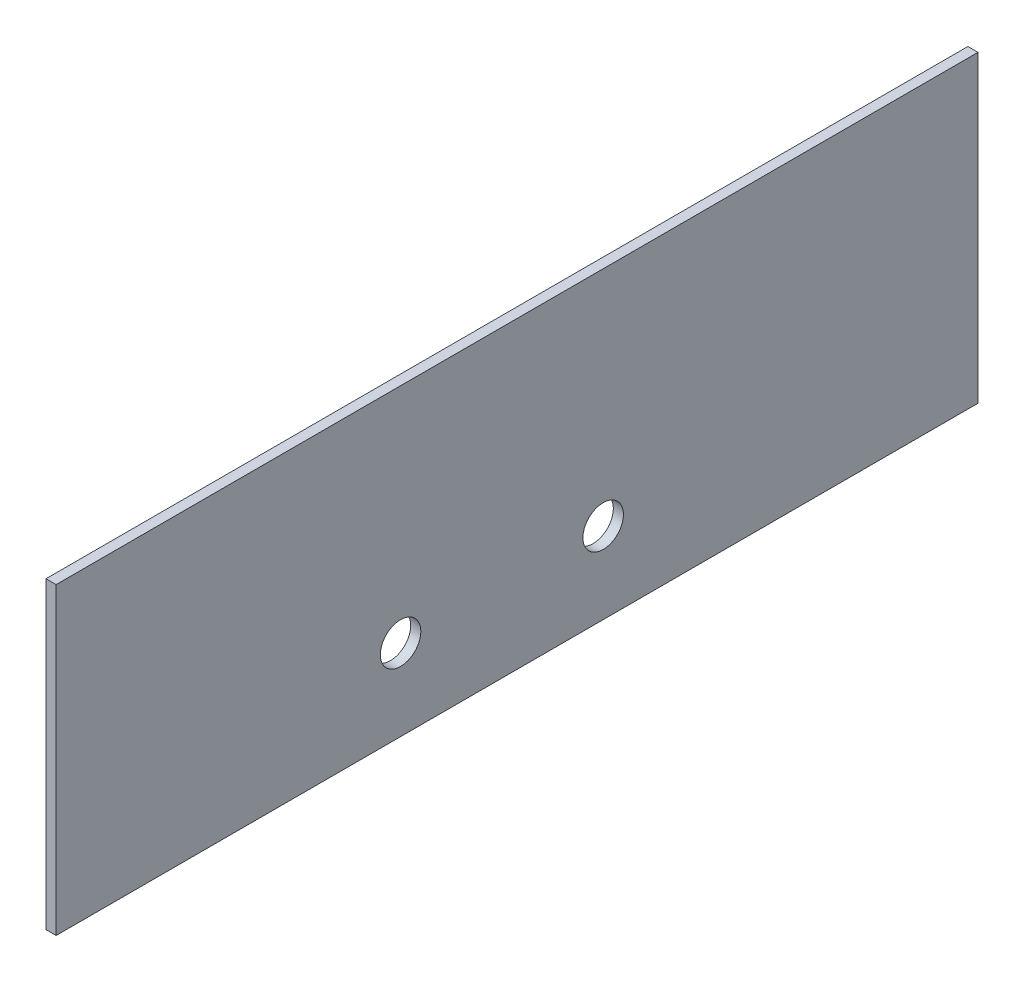
ISO-10303-21;
HEADER;
FILE_DESCRIPTION(('STEP AP214'),'2;1');
FILE_NAME('part.step','',(''),(''),'','','');
FILE_SCHEMA(('AUTOMOTIVE_DESIGN { 1 0 10303 214 1 1 1 1 }'));
ENDSEC;
DATA;
#1=APPLICATION_CONTEXT('core data for automotive mechanical design processes');
#2=APPLICATION_PROTOCOL_DEFINITION('international standard','automotive_design',2000,#1);
#3=PRODUCT_CONTEXT('',#1,'mechanical');
#4=PRODUCT('Part','Part','',(#3));
#5=PRODUCT_RELATED_PRODUCT_CATEGORY('part','',(#4));
#6=PRODUCT_DEFINITION_FORMATION('','',#4);
#7=PRODUCT_DEFINITION_CONTEXT('part definition',#1,'design');
#8=PRODUCT_DEFINITION('design','',#6,#7);
#9=PRODUCT_DEFINITION_SHAPE('','',#8);
#10=(LENGTH_UNIT() NAMED_UNIT(*) SI_UNIT(.MILLI.,.METRE.));
#11=(NAMED_UNIT(*) PLANE_ANGLE_UNIT() SI_UNIT($,.RADIAN.));
#12=(NAMED_UNIT(*) SI_UNIT($,.STERADIAN.) SOLID_ANGLE_UNIT());
#13=UNCERTAINTY_MEASURE_WITH_UNIT(LENGTH_MEASURE(1.E-05),#10,'distance_accuracy_value','');
#14=(GEOMETRIC_REPRESENTATION_CONTEXT(3) GLOBAL_UNCERTAINTY_ASSIGNED_CONTEXT((#13)) GLOBAL_UNIT_ASSIGNED_CONTEXT((#10,
#11,#12)) REPRESENTATION_CONTEXT('',''));
#15=CARTESIAN_POINT('',(0.,0.,0.));
#16=DIRECTION('',(0.,0.,1.));
#17=DIRECTION('',(1.,0.,0.));
#18=AXIS2_PLACEMENT_3D('',#15,#16,#17);
#19=CARTESIAN_POINT('',(-62.,0.,0.));
#20=DIRECTION('',(1.,0.,0.));
#21=DIRECTION('',(0.,0.,-1.));
#22=AXIS2_PLACEMENT_3D('',#19,#20,#21);
#23=PLANE('',#22);
#24=DIRECTION('',(0.,0.,1.));
#25=VECTOR('',#24,1.);
#26=CARTESIAN_POINT('',(-62.,60.,-2.00000000000001));
#27=LINE('',#26,#25);
#28=CARTESIAN_POINT('',(-62.,60.,-2.00000000000001));
#29=VERTEX_POINT('',#28);
#30=CARTESIAN_POINT('',(-62.,60.,180.));
#31=VERTEX_POINT('',#30);
#32=EDGE_CURVE('E120',#29,#31,#27,.T.);
#33=ORIENTED_EDGE('',*,*,#32,.F.);
#34=DIRECTION('',(0.,-1.,0.));
#35=VECTOR('',#34,1.);
#36=CARTESIAN_POINT('',(-62.,60.,-2.00000000000001));
#37=LINE('',#36,#35);
#38=CARTESIAN_POINT('',(-62.,0.,-2.00000000000001));
#39=VERTEX_POINT('',#38);
#40=EDGE_CURVE('E107',#29,#39,#37,.T.);
#41=ORIENTED_EDGE('',*,*,#40,.T.);
#42=DIRECTION('',(0.,0.,1.));
#43=VECTOR('',#42,1.);
#44=CARTESIAN_POINT('',(-62.,0.,-2.00000000000001));
#45=LINE('',#44,#43);
#46=CARTESIAN_POINT('',(-62.,0.,180.));
#47=VERTEX_POINT('',#46);
#48=EDGE_CURVE('E102',#39,#47,#45,.T.);
#49=ORIENTED_EDGE('',*,*,#48,.T.);
#50=DIRECTION('',(0.,-1.,0.));
#51=VECTOR('',#50,1.);
#52=CARTESIAN_POINT('',(-62.,60.,180.));
#53=LINE('',#52,#51);
#54=EDGE_CURVE('E106',#31,#47,#53,.T.);
#55=ORIENTED_EDGE('',*,*,#54,.F.);
#56=EDGE_LOOP('',(#33,#41,#49,#55));
#57=FACE_BOUND('',#56,.T.);
#58=CARTESIAN_POINT('',(-62.,16.,72.));
#59=DIRECTION('',(-1.,0.,0.));
#60=DIRECTION('',(0.,0.,1.));
#61=AXIS2_PLACEMENT_3D('',#58,#59,#60);
#62=CIRCLE('',#61,3.99999999999999);
#63=CARTESIAN_POINT('',(-62.,16.,76.));
#64=VERTEX_POINT('',#63);
#65=EDGE_CURVE('E138',#64,#64,#62,.T.);
#66=ORIENTED_EDGE('',*,*,#65,.F.);
#67=EDGE_LOOP('',(#66));
#68=FACE_BOUND('',#67,.T.);
#69=CARTESIAN_POINT('',(-62.,16.,112.));
#70=DIRECTION('',(-1.,0.,0.));
#71=DIRECTION('',(0.,0.,1.));
#72=AXIS2_PLACEMENT_3D('',#69,#70,#71);
#73=CIRCLE('',#72,3.99999999999999);
#74=CARTESIAN_POINT('',(-62.,16.,116.));
#75=VERTEX_POINT('',#74);
#76=EDGE_CURVE('E176',#75,#75,#73,.T.);
#77=ORIENTED_EDGE('',*,*,#76,.F.);
#78=EDGE_LOOP('',(#77));
#79=FACE_BOUND('',#78,.T.);
#80=ADVANCED_FACE('F45',(#57,#68,#79),#23,.F.);
#81=CARTESIAN_POINT('',(-62.,60.,-2.00000000000001));
#82=DIRECTION('',(0.,1.,0.));
#83=DIRECTION('',(0.,0.,1.));
#84=AXIS2_PLACEMENT_3D('',#81,#82,#83);
#85=PLANE('',#84);
#86=DIRECTION('',(0.,0.,1.));
#87=VECTOR('',#86,1.);
#88=CARTESIAN_POINT('',(-60.,60.,-2.00000000000001));
#89=LINE('',#88,#87);
#90=CARTESIAN_POINT('',(-60.,60.,-2.00000000000001));
#91=VERTEX_POINT('',#90);
#92=CARTESIAN_POINT('',(-60.,60.,180.));
#93=VERTEX_POINT('',#92);
#94=EDGE_CURVE('E148',#91,#93,#89,.T.);
#95=ORIENTED_EDGE('',*,*,#94,.F.);
#96=DIRECTION('',(1.,0.,0.));
#97=VECTOR('',#96,1.);
#98=CARTESIAN_POINT('',(-62.,60.,-2.00000000000001));
#99=LINE('',#98,#97);
#100=EDGE_CURVE('E12',#29,#91,#99,.T.);
#101=ORIENTED_EDGE('',*,*,#100,.F.);
#102=ORIENTED_EDGE('',*,*,#32,.T.);
#103=DIRECTION('',(1.,0.,0.));
#104=VECTOR('',#103,1.);
#105=CARTESIAN_POINT('',(-62.,60.,180.));
#106=LINE('',#105,#104);
#107=EDGE_CURVE('E50',#31,#93,#106,.T.);
#108=ORIENTED_EDGE('',*,*,#107,.T.);
#109=EDGE_LOOP('',(#95,#101,#102,#108));
#110=FACE_BOUND('',#109,.T.);
#111=ADVANCED_FACE('F48',(#110),#85,.T.);
#112=CARTESIAN_POINT('',(-62.,60.,-2.00000000000001));
#113=DIRECTION('',(0.,0.,1.));
#114=DIRECTION('',(1.,0.,0.));
#115=AXIS2_PLACEMENT_3D('',#112,#113,#114);
#116=PLANE('',#115);
#117=DIRECTION('',(0.,-1.,0.));
#118=VECTOR('',#117,1.);
#119=CARTESIAN_POINT('',(-60.,60.,-2.00000000000001));
#120=LINE('',#119,#118);
#121=CARTESIAN_POINT('',(-60.,0.,-2.00000000000001));
#122=VERTEX_POINT('',#121);
#123=EDGE_CURVE('E89',#91,#122,#120,.T.);
#124=ORIENTED_EDGE('',*,*,#123,.T.);
#125=DIRECTION('',(1.,0.,0.));
#126=VECTOR('',#125,1.);
#127=CARTESIAN_POINT('',(-62.,0.,-2.00000000000001));
#128=LINE('',#127,#126);
#129=EDGE_CURVE('E58',#39,#122,#128,.T.);
#130=ORIENTED_EDGE('',*,*,#129,.F.);
#131=ORIENTED_EDGE('',*,*,#40,.F.);
#132=ORIENTED_EDGE('',*,*,#100,.T.);
#133=EDGE_LOOP('',(#124,#130,#131,#132));
#134=FACE_BOUND('',#133,.T.);
#135=ADVANCED_FACE('F195',(#134),#116,.F.);
#136=CARTESIAN_POINT('',(-62.,0.,-2.00000000000001));
#137=DIRECTION('',(0.,1.,0.));
#138=DIRECTION('',(0.,0.,1.));
#139=AXIS2_PLACEMENT_3D('',#136,#137,#138);
#140=PLANE('',#139);
#141=DIRECTION('',(0.,0.,1.));
#142=VECTOR('',#141,1.);
#143=CARTESIAN_POINT('',(-60.,0.,-2.00000000000001));
#144=LINE('',#143,#142);
#145=CARTESIAN_POINT('',(-60.,0.,180.));
#146=VERTEX_POINT('',#145);
#147=EDGE_CURVE('E115',#122,#146,#144,.T.);
#148=ORIENTED_EDGE('',*,*,#147,.T.);
#149=DIRECTION('',(1.,0.,0.));
#150=VECTOR('',#149,1.);
#151=CARTESIAN_POINT('',(-62.,0.,180.));
#152=LINE('',#151,#150);
#153=EDGE_CURVE('E112',#47,#146,#152,.T.);
#154=ORIENTED_EDGE('',*,*,#153,.F.);
#155=ORIENTED_EDGE('',*,*,#48,.F.);
#156=ORIENTED_EDGE('',*,*,#129,.T.);
#157=EDGE_LOOP('',(#148,#154,#155,#156));
#158=FACE_BOUND('',#157,.T.);
#159=ADVANCED_FACE('F113',(#158),#140,.F.);
#160=CARTESIAN_POINT('',(-62.,60.,180.));
#161=DIRECTION('',(0.,0.,1.));
#162=DIRECTION('',(1.,0.,0.));
#163=AXIS2_PLACEMENT_3D('',#160,#161,#162);
#164=PLANE('',#163);
#165=DIRECTION('',(0.,-1.,0.));
#166=VECTOR('',#165,1.);
#167=CARTESIAN_POINT('',(-60.,60.,180.));
#168=LINE('',#167,#166);
#169=EDGE_CURVE('E165',#93,#146,#168,.T.);
#170=ORIENTED_EDGE('',*,*,#169,.F.);
#171=ORIENTED_EDGE('',*,*,#107,.F.);
#172=ORIENTED_EDGE('',*,*,#54,.T.);
#173=ORIENTED_EDGE('',*,*,#153,.T.);
#174=EDGE_LOOP('',(#170,#171,#172,#173));
#175=FACE_BOUND('',#174,.T.);
#176=ADVANCED_FACE('F118',(#175),#164,.T.);
#177=CARTESIAN_POINT('',(-60.,0.,0.));
#178=DIRECTION('',(1.,0.,0.));
#179=DIRECTION('',(0.,0.,-1.));
#180=AXIS2_PLACEMENT_3D('',#177,#178,#179);
#181=PLANE('',#180);
#182=CARTESIAN_POINT('',(-60.,16.,112.));
#183=DIRECTION('',(1.,0.,0.));
#184=DIRECTION('',(0.,0.,-1.));
#185=AXIS2_PLACEMENT_3D('',#182,#183,#184);
#186=CIRCLE('',#185,3.99999999999999);
#187=CARTESIAN_POINT('',(-60.,16.,108.));
#188=VERTEX_POINT('',#187);
#189=EDGE_CURVE('E143',#188,#188,#186,.T.);
#190=ORIENTED_EDGE('',*,*,#189,.F.);
#191=EDGE_LOOP('',(#190));
#192=FACE_BOUND('',#191,.T.);
#193=CARTESIAN_POINT('',(-60.,16.,72.));
#194=DIRECTION('',(1.,0.,0.));
#195=DIRECTION('',(0.,0.,-1.));
#196=AXIS2_PLACEMENT_3D('',#193,#194,#195);
#197=CIRCLE('',#196,3.99999999999999);
#198=CARTESIAN_POINT('',(-60.,16.,68.));
#199=VERTEX_POINT('',#198);
#200=EDGE_CURVE('E142',#199,#199,#197,.T.);
#201=ORIENTED_EDGE('',*,*,#200,.F.);
#202=EDGE_LOOP('',(#201));
#203=FACE_BOUND('',#202,.T.);
#204=ORIENTED_EDGE('',*,*,#94,.T.);
#205=ORIENTED_EDGE('',*,*,#169,.T.);
#206=ORIENTED_EDGE('',*,*,#147,.F.);
#207=ORIENTED_EDGE('',*,*,#123,.F.);
#208=EDGE_LOOP('',(#204,#205,#206,#207));
#209=FACE_BOUND('',#208,.T.);
#210=ADVANCED_FACE('F187',(#192,#203,#209),#181,.T.);
#211=CARTESIAN_POINT('',(-62.,16.,72.));
#212=DIRECTION('',(-1.,0.,0.));
#213=DIRECTION('',(0.,0.,1.));
#214=AXIS2_PLACEMENT_3D('',#211,#212,#213);
#215=CYLINDRICAL_SURFACE('',#214,3.99999999999999);
#216=ORIENTED_EDGE('',*,*,#65,.T.);
#217=EDGE_LOOP('',(#216));
#218=FACE_BOUND('',#217,.T.);
#219=ORIENTED_EDGE('',*,*,#200,.T.);
#220=EDGE_LOOP('',(#219));
#221=FACE_BOUND('',#220,.T.);
#222=ADVANCED_FACE('F190',(#218,#221),#215,.F.);
#223=CARTESIAN_POINT('',(-62.,16.,112.));
#224=DIRECTION('',(-1.,0.,0.));
#225=DIRECTION('',(0.,0.,1.));
#226=AXIS2_PLACEMENT_3D('',#223,#224,#225);
#227=CYLINDRICAL_SURFACE('',#226,3.99999999999999);
#228=ORIENTED_EDGE('',*,*,#76,.T.);
#229=EDGE_LOOP('',(#228));
#230=FACE_BOUND('',#229,.T.);
#231=ORIENTED_EDGE('',*,*,#189,.T.);
#232=EDGE_LOOP('',(#231));
#233=FACE_BOUND('',#232,.T.);
#234=ADVANCED_FACE('F185',(#230,#233),#227,.F.);
#235=CLOSED_SHELL('',(#80,#111,#135,#159,#176,#210,#222,#234));
#236=MANIFOLD_SOLID_BREP('B2',#235);
#237=ADVANCED_BREP_SHAPE_REPRESENTATION('',(#18,#236),#14);
#238=SHAPE_DEFINITION_REPRESENTATION(#9,#237);
ENDSEC;
END-ISO-10303-21;
